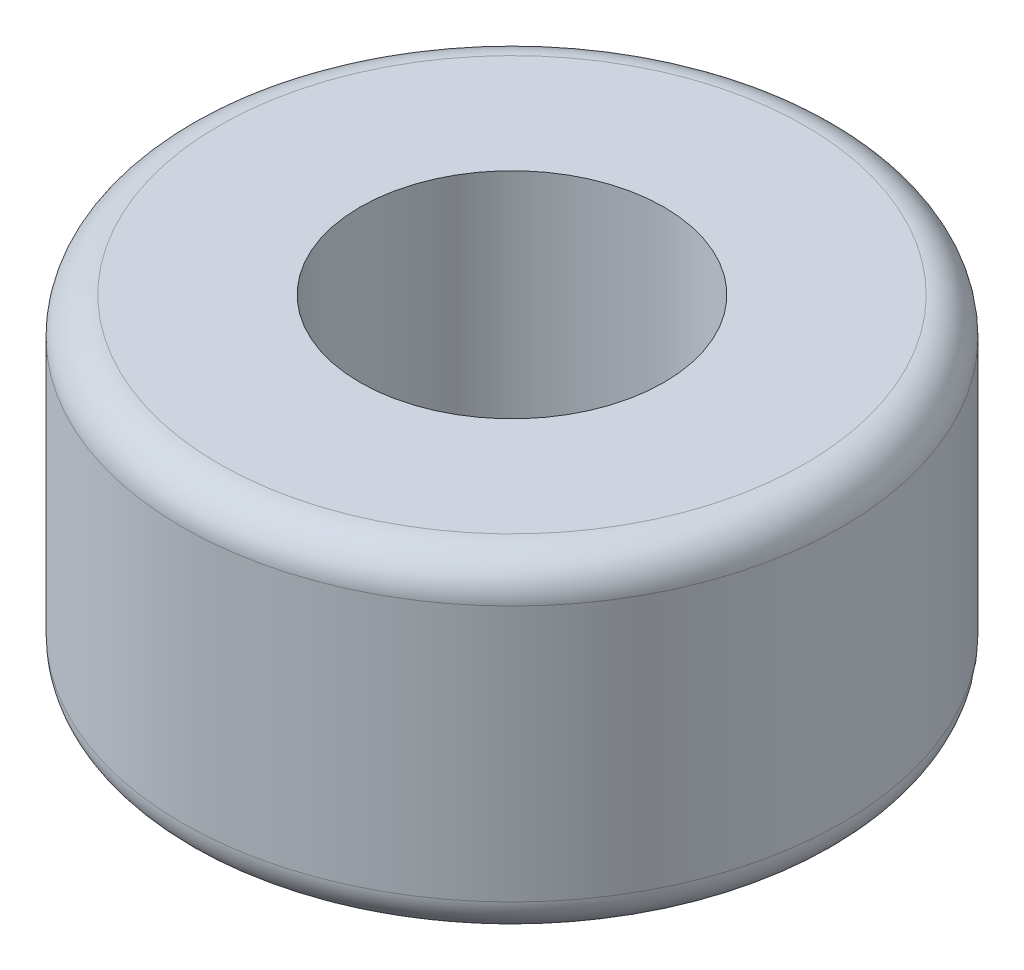
ISO-10303-21;
HEADER;
FILE_DESCRIPTION(('STEP AP214'),'2;1');
FILE_NAME('part.step','',(''),(''),'','','');
FILE_SCHEMA(('AUTOMOTIVE_DESIGN { 1 0 10303 214 1 1 1 1 }'));
ENDSEC;
DATA;
#1=APPLICATION_CONTEXT('core data for automotive mechanical design processes');
#2=APPLICATION_PROTOCOL_DEFINITION('international standard','automotive_design',2000,#1);
#3=PRODUCT_CONTEXT('',#1,'mechanical');
#4=PRODUCT('Part','Part','',(#3));
#5=PRODUCT_RELATED_PRODUCT_CATEGORY('part','',(#4));
#6=PRODUCT_DEFINITION_FORMATION('','',#4);
#7=PRODUCT_DEFINITION_CONTEXT('part definition',#1,'design');
#8=PRODUCT_DEFINITION('design','',#6,#7);
#9=PRODUCT_DEFINITION_SHAPE('','',#8);
#10=(LENGTH_UNIT() NAMED_UNIT(*) SI_UNIT(.MILLI.,.METRE.));
#11=(NAMED_UNIT(*) PLANE_ANGLE_UNIT() SI_UNIT($,.RADIAN.));
#12=(NAMED_UNIT(*) SI_UNIT($,.STERADIAN.) SOLID_ANGLE_UNIT());
#13=UNCERTAINTY_MEASURE_WITH_UNIT(LENGTH_MEASURE(1.E-05),#10,'distance_accuracy_value','');
#14=(GEOMETRIC_REPRESENTATION_CONTEXT(3) GLOBAL_UNCERTAINTY_ASSIGNED_CONTEXT((#13)) GLOBAL_UNIT_ASSIGNED_CONTEXT((#10,
#11,#12)) REPRESENTATION_CONTEXT('',''));
#15=CARTESIAN_POINT('',(0.,0.,0.));
#16=DIRECTION('',(0.,0.,1.));
#17=DIRECTION('',(1.,0.,0.));
#18=AXIS2_PLACEMENT_3D('',#15,#16,#17);
#19=CARTESIAN_POINT('',(0.,9.,0.));
#20=DIRECTION('',(0.,1.,0.));
#21=DIRECTION('',(0.,0.,1.));
#22=AXIS2_PLACEMENT_3D('',#19,#20,#21);
#23=PLANE('',#22);
#24=CARTESIAN_POINT('',(0.,9.,0.));
#25=DIRECTION('',(0.,1.,0.));
#26=DIRECTION('',(0.,0.,1.));
#27=AXIS2_PLACEMENT_3D('',#24,#25,#26);
#28=CIRCLE('',#27,8.);
#29=CARTESIAN_POINT('',(0.,9.,8.));
#30=VERTEX_POINT('',#29);
#31=EDGE_CURVE('E10',#30,#30,#28,.T.);
#32=ORIENTED_EDGE('',*,*,#31,.T.);
#33=EDGE_LOOP('',(#32));
#34=FACE_BOUND('',#33,.T.);
#35=CARTESIAN_POINT('',(0.,9.,0.));
#36=DIRECTION('',(0.,1.,0.));
#37=DIRECTION('',(0.,0.,1.));
#38=AXIS2_PLACEMENT_3D('',#35,#36,#37);
#39=CIRCLE('',#38,4.15);
#40=CARTESIAN_POINT('',(0.,9.,4.15));
#41=VERTEX_POINT('',#40);
#42=EDGE_CURVE('E52',#41,#41,#39,.T.);
#43=ORIENTED_EDGE('',*,*,#42,.F.);
#44=EDGE_LOOP('',(#43));
#45=FACE_BOUND('',#44,.T.);
#46=ADVANCED_FACE('F32',(#34,#45),#23,.T.);
#47=CARTESIAN_POINT('',(0.,0.,0.));
#48=DIRECTION('',(0.,1.,0.));
#49=DIRECTION('',(0.,0.,1.));
#50=AXIS2_PLACEMENT_3D('',#47,#48,#49);
#51=PLANE('',#50);
#52=CARTESIAN_POINT('',(0.,0.,0.));
#53=DIRECTION('',(0.,1.,0.));
#54=DIRECTION('',(0.,0.,1.));
#55=AXIS2_PLACEMENT_3D('',#52,#53,#54);
#56=CIRCLE('',#55,8.);
#57=CARTESIAN_POINT('',(0.,0.,8.));
#58=VERTEX_POINT('',#57);
#59=EDGE_CURVE('E39',#58,#58,#56,.F.);
#60=ORIENTED_EDGE('',*,*,#59,.T.);
#61=EDGE_LOOP('',(#60));
#62=FACE_BOUND('',#61,.T.);
#63=CARTESIAN_POINT('',(0.,0.,0.));
#64=DIRECTION('',(0.,1.,0.));
#65=DIRECTION('',(0.,0.,1.));
#66=AXIS2_PLACEMENT_3D('',#63,#64,#65);
#67=CIRCLE('',#66,4.15);
#68=CARTESIAN_POINT('',(0.,0.,4.15));
#69=VERTEX_POINT('',#68);
#70=EDGE_CURVE('E53',#69,#69,#67,.T.);
#71=ORIENTED_EDGE('',*,*,#70,.T.);
#72=EDGE_LOOP('',(#71));
#73=FACE_BOUND('',#72,.T.);
#74=ADVANCED_FACE('F63',(#62,#73),#51,.F.);
#75=CARTESIAN_POINT('',(0.,9.,0.));
#76=DIRECTION('',(0.,-1.,0.));
#77=DIRECTION('',(0.,0.,-1.));
#78=AXIS2_PLACEMENT_3D('',#75,#76,#77);
#79=CYLINDRICAL_SURFACE('',#78,9.);
#80=CARTESIAN_POINT('',(0.,0.999999999999999,0.));
#81=DIRECTION('',(0.,1.,0.));
#82=DIRECTION('',(0.,0.,1.));
#83=AXIS2_PLACEMENT_3D('',#80,#81,#82);
#84=CIRCLE('',#83,9.);
#85=CARTESIAN_POINT('',(0.,0.999999999999999,9.));
#86=VERTEX_POINT('',#85);
#87=EDGE_CURVE('E43',#86,#86,#84,.T.);
#88=ORIENTED_EDGE('',*,*,#87,.T.);
#89=EDGE_LOOP('',(#88));
#90=FACE_BOUND('',#89,.T.);
#91=CARTESIAN_POINT('',(0.,8.,0.));
#92=DIRECTION('',(0.,1.,0.));
#93=DIRECTION('',(0.,0.,1.));
#94=AXIS2_PLACEMENT_3D('',#91,#92,#93);
#95=CIRCLE('',#94,9.);
#96=CARTESIAN_POINT('',(0.,8.,9.));
#97=VERTEX_POINT('',#96);
#98=EDGE_CURVE('E47',#97,#97,#95,.F.);
#99=ORIENTED_EDGE('',*,*,#98,.T.);
#100=EDGE_LOOP('',(#99));
#101=FACE_BOUND('',#100,.T.);
#102=ADVANCED_FACE('F68',(#90,#101),#79,.T.);
#103=CARTESIAN_POINT('',(0.,9.,0.));
#104=DIRECTION('',(0.,-1.,0.));
#105=DIRECTION('',(0.,0.,-1.));
#106=AXIS2_PLACEMENT_3D('',#103,#104,#105);
#107=CYLINDRICAL_SURFACE('',#106,4.15);
#108=ORIENTED_EDGE('',*,*,#42,.T.);
#109=EDGE_LOOP('',(#108));
#110=FACE_BOUND('',#109,.T.);
#111=ORIENTED_EDGE('',*,*,#70,.F.);
#112=EDGE_LOOP('',(#111));
#113=FACE_BOUND('',#112,.T.);
#114=ADVANCED_FACE('F59',(#110,#113),#107,.F.);
#115=CARTESIAN_POINT('',(0.,0.999999999999999,0.));
#116=DIRECTION('',(0.,1.,0.));
#117=DIRECTION('',(0.,0.,1.));
#118=AXIS2_PLACEMENT_3D('',#115,#116,#117);
#119=TOROIDAL_SURFACE('',#118,8.,1.);
#120=ORIENTED_EDGE('',*,*,#59,.F.);
#121=EDGE_LOOP('',(#120));
#122=FACE_BOUND('',#121,.T.);
#123=ORIENTED_EDGE('',*,*,#87,.F.);
#124=EDGE_LOOP('',(#123));
#125=FACE_BOUND('',#124,.T.);
#126=ADVANCED_FACE('F74',(#122,#125),#119,.T.);
#127=CARTESIAN_POINT('',(0.,8.,0.));
#128=DIRECTION('',(0.,1.,0.));
#129=DIRECTION('',(0.,0.,1.));
#130=AXIS2_PLACEMENT_3D('',#127,#128,#129);
#131=TOROIDAL_SURFACE('',#130,8.,1.);
#132=ORIENTED_EDGE('',*,*,#98,.F.);
#133=EDGE_LOOP('',(#132));
#134=FACE_BOUND('',#133,.T.);
#135=ORIENTED_EDGE('',*,*,#31,.F.);
#136=EDGE_LOOP('',(#135));
#137=FACE_BOUND('',#136,.T.);
#138=ADVANCED_FACE('F34',(#134,#137),#131,.T.);
#139=CLOSED_SHELL('',(#46,#74,#102,#114,#126,#138));
#140=MANIFOLD_SOLID_BREP('B2',#139);
#141=ADVANCED_BREP_SHAPE_REPRESENTATION('',(#18,#140),#14);
#142=SHAPE_DEFINITION_REPRESENTATION(#9,#141);
ENDSEC;
END-ISO-10303-21;
